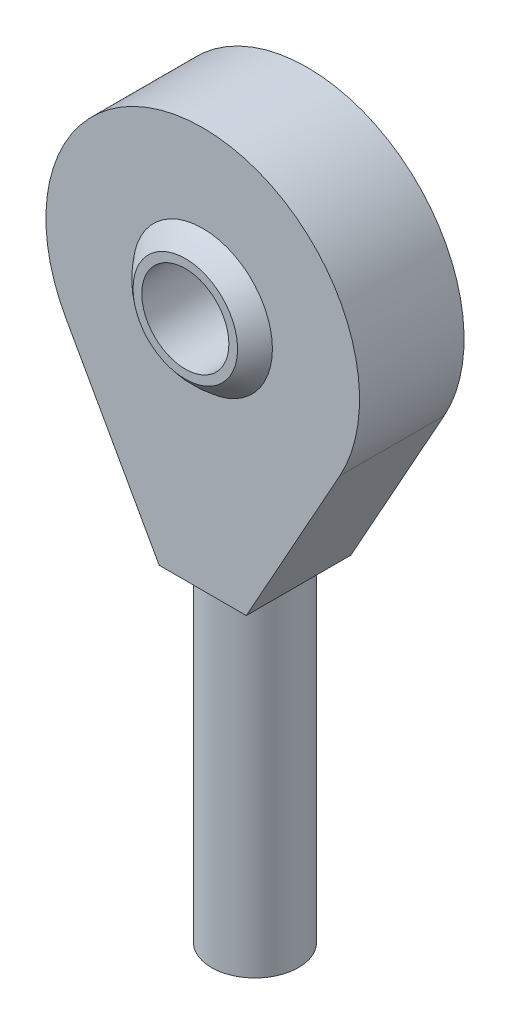
ISO-10303-21;
HEADER;
FILE_DESCRIPTION(('STEP AP214'),'2;1');
FILE_NAME('part.step','',(''),(''),'','','');
FILE_SCHEMA(('AUTOMOTIVE_DESIGN { 1 0 10303 214 1 1 1 1 }'));
ENDSEC;
DATA;
#1=APPLICATION_CONTEXT('core data for automotive mechanical design processes');
#2=APPLICATION_PROTOCOL_DEFINITION('international standard','automotive_design',2000,#1);
#3=PRODUCT_CONTEXT('',#1,'mechanical');
#4=PRODUCT('Part','Part','',(#3));
#5=PRODUCT_RELATED_PRODUCT_CATEGORY('part','',(#4));
#6=PRODUCT_DEFINITION_FORMATION('','',#4);
#7=PRODUCT_DEFINITION_CONTEXT('part definition',#1,'design');
#8=PRODUCT_DEFINITION('design','',#6,#7);
#9=PRODUCT_DEFINITION_SHAPE('','',#8);
#10=(LENGTH_UNIT() NAMED_UNIT(*) SI_UNIT(.MILLI.,.METRE.));
#11=(NAMED_UNIT(*) PLANE_ANGLE_UNIT() SI_UNIT($,.RADIAN.));
#12=(NAMED_UNIT(*) SI_UNIT($,.STERADIAN.) SOLID_ANGLE_UNIT());
#13=UNCERTAINTY_MEASURE_WITH_UNIT(LENGTH_MEASURE(1.E-05),#10,'distance_accuracy_value','');
#14=(GEOMETRIC_REPRESENTATION_CONTEXT(3) GLOBAL_UNCERTAINTY_ASSIGNED_CONTEXT((#13)) GLOBAL_UNIT_ASSIGNED_CONTEXT((#10,
#11,#12)) REPRESENTATION_CONTEXT('',''));
#15=CARTESIAN_POINT('',(0.,0.,0.));
#16=DIRECTION('',(0.,0.,1.));
#17=DIRECTION('',(1.,0.,0.));
#18=AXIS2_PLACEMENT_3D('',#15,#16,#17);
#19=CARTESIAN_POINT('',(0.,32.9999999999935,3.));
#20=DIRECTION('',(0.,0.,1.));
#21=DIRECTION('',(1.,0.,0.));
#22=AXIS2_PLACEMENT_3D('',#19,#20,#21);
#23=PLANE('',#22);
#24=DIRECTION('',(1.,0.,0.));
#25=VECTOR('',#24,1.);
#26=CARTESIAN_POINT('',(-2.5,19.,3.));
#27=LINE('',#26,#25);
#28=CARTESIAN_POINT('',(-2.5,19.,3.));
#29=VERTEX_POINT('',#28);
#30=CARTESIAN_POINT('',(2.5,19.,3.));
#31=VERTEX_POINT('',#30);
#32=EDGE_CURVE('E96',#29,#31,#27,.T.);
#33=ORIENTED_EDGE('',*,*,#32,.T.);
#34=DIRECTION('',(0.486880620855715,0.873468523207994,0.));
#35=VECTOR('',#34,1.);
#36=CARTESIAN_POINT('',(2.5,19.,3.));
#37=LINE('',#36,#35);
#38=CARTESIAN_POINT('',(7.86121670887189,28.6180744122986,3.));
#39=VERTEX_POINT('',#38);
#40=EDGE_CURVE('E91',#31,#39,#37,.T.);
#41=ORIENTED_EDGE('',*,*,#40,.T.);
#42=CARTESIAN_POINT('',(0.,32.9999999999935,3.));
#43=DIRECTION('',(0.,0.,1.));
#44=DIRECTION('',(1.,0.,0.));
#45=AXIS2_PLACEMENT_3D('',#42,#43,#44);
#46=CIRCLE('',#45,8.99999999999684);
#47=CARTESIAN_POINT('',(-7.86121670887194,28.6180744122986,3.));
#48=VERTEX_POINT('',#47);
#49=EDGE_CURVE('E94',#39,#48,#46,.T.);
#50=ORIENTED_EDGE('',*,*,#49,.T.);
#51=DIRECTION('',(0.486880620855715,-0.873468523207994,0.));
#52=VECTOR('',#51,1.);
#53=CARTESIAN_POINT('',(-2.5,19.,3.));
#54=LINE('',#53,#52);
#55=EDGE_CURVE('E60',#48,#29,#54,.T.);
#56=ORIENTED_EDGE('',*,*,#55,.T.);
#57=EDGE_LOOP('',(#33,#41,#50,#56));
#58=FACE_BOUND('',#57,.T.);
#59=CARTESIAN_POINT('',(0.,33.,3.));
#60=DIRECTION('',(0.,0.,1.));
#61=DIRECTION('',(1.,0.,0.));
#62=AXIS2_PLACEMENT_3D('',#59,#60,#61);
#63=CIRCLE('',#62,4.);
#64=CARTESIAN_POINT('',(4.,33.,3.));
#65=VERTEX_POINT('',#64);
#66=EDGE_CURVE('E113',#65,#65,#63,.F.);
#67=ORIENTED_EDGE('',*,*,#66,.T.);
#68=EDGE_LOOP('',(#67));
#69=FACE_BOUND('',#68,.T.);
#70=ADVANCED_FACE('F41',(#58,#69),#23,.T.);
#71=CARTESIAN_POINT('',(0.,32.9999999999935,-3.));
#72=DIRECTION('',(0.,0.,1.));
#73=DIRECTION('',(1.,0.,0.));
#74=AXIS2_PLACEMENT_3D('',#71,#72,#73);
#75=PLANE('',#74);
#76=DIRECTION('',(1.,0.,0.));
#77=VECTOR('',#76,1.);
#78=CARTESIAN_POINT('',(-2.5,19.,-3.));
#79=LINE('',#78,#77);
#80=CARTESIAN_POINT('',(-2.5,19.,-3.));
#81=VERTEX_POINT('',#80);
#82=CARTESIAN_POINT('',(2.5,19.,-3.));
#83=VERTEX_POINT('',#82);
#84=EDGE_CURVE('E110',#81,#83,#79,.T.);
#85=ORIENTED_EDGE('',*,*,#84,.F.);
#86=DIRECTION('',(0.486880620855715,-0.873468523207994,0.));
#87=VECTOR('',#86,1.);
#88=CARTESIAN_POINT('',(-2.5,19.,-3.));
#89=LINE('',#88,#87);
#90=CARTESIAN_POINT('',(-7.86121670887194,28.6180744122986,-3.));
#91=VERTEX_POINT('',#90);
#92=EDGE_CURVE('E83',#91,#81,#89,.T.);
#93=ORIENTED_EDGE('',*,*,#92,.F.);
#94=CARTESIAN_POINT('',(0.,32.9999999999935,-3.));
#95=DIRECTION('',(0.,0.,1.));
#96=DIRECTION('',(1.,0.,0.));
#97=AXIS2_PLACEMENT_3D('',#94,#95,#96);
#98=CIRCLE('',#97,8.99999999999684);
#99=CARTESIAN_POINT('',(7.86121670887189,28.6180744122986,-3.));
#100=VERTEX_POINT('',#99);
#101=EDGE_CURVE('E77',#100,#91,#98,.T.);
#102=ORIENTED_EDGE('',*,*,#101,.F.);
#103=DIRECTION('',(0.486880620855715,0.873468523207994,0.));
#104=VECTOR('',#103,1.);
#105=CARTESIAN_POINT('',(2.5,19.,-3.));
#106=LINE('',#105,#104);
#107=EDGE_CURVE('E101',#83,#100,#106,.T.);
#108=ORIENTED_EDGE('',*,*,#107,.F.);
#109=EDGE_LOOP('',(#85,#93,#102,#108));
#110=FACE_BOUND('',#109,.T.);
#111=CARTESIAN_POINT('',(0.,33.,-3.));
#112=DIRECTION('',(0.,0.,1.));
#113=DIRECTION('',(1.,0.,0.));
#114=AXIS2_PLACEMENT_3D('',#111,#112,#113);
#115=CIRCLE('',#114,4.);
#116=CARTESIAN_POINT('',(4.,33.,-3.));
#117=VERTEX_POINT('',#116);
#118=EDGE_CURVE('E12',#117,#117,#115,.F.);
#119=ORIENTED_EDGE('',*,*,#118,.F.);
#120=EDGE_LOOP('',(#119));
#121=FACE_BOUND('',#120,.T.);
#122=ADVANCED_FACE('F154',(#110,#121),#75,.F.);
#123=CARTESIAN_POINT('',(-2.5,19.,3.));
#124=DIRECTION('',(0.,1.,0.));
#125=DIRECTION('',(0.,0.,1.));
#126=AXIS2_PLACEMENT_3D('',#123,#124,#125);
#127=PLANE('',#126);
#128=ORIENTED_EDGE('',*,*,#84,.T.);
#129=DIRECTION('',(0.,0.,-1.));
#130=VECTOR('',#129,1.);
#131=CARTESIAN_POINT('',(2.5,19.,3.));
#132=LINE('',#131,#130);
#133=EDGE_CURVE('E51',#31,#83,#132,.T.);
#134=ORIENTED_EDGE('',*,*,#133,.F.);
#135=ORIENTED_EDGE('',*,*,#32,.F.);
#136=DIRECTION('',(0.,0.,-1.));
#137=VECTOR('',#136,1.);
#138=CARTESIAN_POINT('',(-2.5,19.,3.));
#139=LINE('',#138,#137);
#140=EDGE_CURVE('E106',#29,#81,#139,.T.);
#141=ORIENTED_EDGE('',*,*,#140,.T.);
#142=EDGE_LOOP('',(#128,#134,#135,#141));
#143=FACE_BOUND('',#142,.T.);
#144=ADVANCED_FACE('F43',(#143),#127,.F.);
#145=CARTESIAN_POINT('',(2.5,19.,3.));
#146=DIRECTION('',(-0.873468523207994,0.486880620855715,0.));
#147=DIRECTION('',(-0.486880620855715,-0.873468523207994,0.));
#148=AXIS2_PLACEMENT_3D('',#145,#146,#147);
#149=PLANE('',#148);
#150=ORIENTED_EDGE('',*,*,#107,.T.);
#151=DIRECTION('',(0.,0.,-1.));
#152=VECTOR('',#151,1.);
#153=CARTESIAN_POINT('',(7.86121670887189,28.6180744122986,3.));
#154=LINE('',#153,#152);
#155=EDGE_CURVE('E99',#39,#100,#154,.T.);
#156=ORIENTED_EDGE('',*,*,#155,.F.);
#157=ORIENTED_EDGE('',*,*,#40,.F.);
#158=ORIENTED_EDGE('',*,*,#133,.T.);
#159=EDGE_LOOP('',(#150,#156,#157,#158));
#160=FACE_BOUND('',#159,.T.);
#161=ADVANCED_FACE('F100',(#160),#149,.F.);
#162=CARTESIAN_POINT('',(0.,32.9999999999935,3.));
#163=DIRECTION('',(0.,0.,-1.));
#164=DIRECTION('',(-1.,0.,0.));
#165=AXIS2_PLACEMENT_3D('',#162,#163,#164);
#166=CYLINDRICAL_SURFACE('',#165,8.99999999999684);
#167=ORIENTED_EDGE('',*,*,#101,.T.);
#168=DIRECTION('',(0.,0.,-1.));
#169=VECTOR('',#168,1.);
#170=CARTESIAN_POINT('',(-7.86121670887194,28.6180744122986,3.));
#171=LINE('',#170,#169);
#172=EDGE_CURVE('E102',#48,#91,#171,.T.);
#173=ORIENTED_EDGE('',*,*,#172,.F.);
#174=ORIENTED_EDGE('',*,*,#49,.F.);
#175=ORIENTED_EDGE('',*,*,#155,.T.);
#176=EDGE_LOOP('',(#167,#173,#174,#175));
#177=FACE_BOUND('',#176,.T.);
#178=ADVANCED_FACE('F104',(#177),#166,.T.);
#179=CARTESIAN_POINT('',(-2.5,19.,3.));
#180=DIRECTION('',(0.873468523207994,0.486880620855715,0.));
#181=DIRECTION('',(-0.486880620855715,0.873468523207994,0.));
#182=AXIS2_PLACEMENT_3D('',#179,#180,#181);
#183=PLANE('',#182);
#184=ORIENTED_EDGE('',*,*,#92,.T.);
#185=ORIENTED_EDGE('',*,*,#140,.F.);
#186=ORIENTED_EDGE('',*,*,#55,.F.);
#187=ORIENTED_EDGE('',*,*,#172,.T.);
#188=EDGE_LOOP('',(#184,#185,#186,#187));
#189=FACE_BOUND('',#188,.T.);
#190=ADVANCED_FACE('F163',(#189),#183,.F.);
#191=CARTESIAN_POINT('',(0.,33.,0.));
#192=DIRECTION('',(-1.,0.,0.));
#193=DIRECTION('',(0.,1.,0.));
#194=AXIS2_PLACEMENT_3D('',#191,#192,#193);
#195=SPHERICAL_SURFACE('',#194,5.);
#196=CARTESIAN_POINT('',(0.,33.,0.));
#197=DIRECTION('',(0.,0.,1.));
#198=DIRECTION('',(1.,0.,0.));
#199=AXIS2_PLACEMENT_3D('',#196,#197,#198);
#200=SPHERICAL_SURFACE('',#199,5.);
#201=CARTESIAN_POINT('',(0.,33.,-4.));
#202=DIRECTION('',(0.,0.,1.));
#203=DIRECTION('',(1.,0.,0.));
#204=AXIS2_PLACEMENT_3D('',#201,#202,#203);
#205=CIRCLE('',#204,3.);
#206=CARTESIAN_POINT('',(3.,33.,-4.));
#207=VERTEX_POINT('',#206);
#208=EDGE_CURVE('E119',#207,#207,#205,.T.);
#209=ORIENTED_EDGE('',*,*,#208,.T.);
#210=EDGE_LOOP('',(#209));
#211=FACE_BOUND('',#210,.T.);
#212=ORIENTED_EDGE('',*,*,#118,.T.);
#213=EDGE_LOOP('',(#212));
#214=FACE_BOUND('',#213,.T.);
#215=ADVANCED_FACE('F166',(#211,#214),#200,.T.);
#216=CARTESIAN_POINT('',(0.,33.,0.));
#217=DIRECTION('',(0.,0.,-1.));
#218=DIRECTION('',(-1.,0.,0.));
#219=AXIS2_PLACEMENT_3D('',#216,#217,#218);
#220=SPHERICAL_SURFACE('',#219,5.);
#221=CARTESIAN_POINT('',(0.,33.,4.));
#222=DIRECTION('',(0.,0.,-1.));
#223=DIRECTION('',(-1.,0.,0.));
#224=AXIS2_PLACEMENT_3D('',#221,#222,#223);
#225=CIRCLE('',#224,3.);
#226=CARTESIAN_POINT('',(-3.,33.,4.));
#227=VERTEX_POINT('',#226);
#228=EDGE_CURVE('E45',#227,#227,#225,.T.);
#229=ORIENTED_EDGE('',*,*,#228,.T.);
#230=EDGE_LOOP('',(#229));
#231=FACE_BOUND('',#230,.T.);
#232=ORIENTED_EDGE('',*,*,#66,.F.);
#233=EDGE_LOOP('',(#232));
#234=FACE_BOUND('',#233,.T.);
#235=ADVANCED_FACE('F151',(#231,#234),#220,.T.);
#236=CARTESIAN_POINT('',(-5.,23.,-4.));
#237=DIRECTION('',(0.,0.,1.));
#238=DIRECTION('',(1.,0.,0.));
#239=AXIS2_PLACEMENT_3D('',#236,#237,#238);
#240=PLANE('',#239);
#241=CARTESIAN_POINT('',(0.,32.9999999999935,-4.));
#242=DIRECTION('',(0.,0.,1.));
#243=DIRECTION('',(1.,0.,0.));
#244=AXIS2_PLACEMENT_3D('',#241,#242,#243);
#245=CIRCLE('',#244,2.5);
#246=CARTESIAN_POINT('',(2.49999999999994,32.9999999999935,-4.));
#247=VERTEX_POINT('',#246);
#248=EDGE_CURVE('E126',#247,#247,#245,.T.);
#249=ORIENTED_EDGE('',*,*,#248,.T.);
#250=EDGE_LOOP('',(#249));
#251=FACE_BOUND('',#250,.T.);
#252=ORIENTED_EDGE('',*,*,#208,.F.);
#253=EDGE_LOOP('',(#252));
#254=FACE_BOUND('',#253,.T.);
#255=ADVANCED_FACE('F143',(#251,#254),#240,.F.);
#256=CARTESIAN_POINT('',(-5.,23.,4.));
#257=DIRECTION('',(0.,0.,-1.));
#258=DIRECTION('',(-1.,0.,0.));
#259=AXIS2_PLACEMENT_3D('',#256,#257,#258);
#260=PLANE('',#259);
#261=CARTESIAN_POINT('',(0.,32.9999999999935,4.));
#262=DIRECTION('',(0.,0.,1.));
#263=DIRECTION('',(1.,0.,0.));
#264=AXIS2_PLACEMENT_3D('',#261,#262,#263);
#265=CIRCLE('',#264,2.5);
#266=CARTESIAN_POINT('',(2.49999999999994,32.9999999999935,4.));
#267=VERTEX_POINT('',#266);
#268=EDGE_CURVE('E130',#267,#267,#265,.T.);
#269=ORIENTED_EDGE('',*,*,#268,.F.);
#270=EDGE_LOOP('',(#269));
#271=FACE_BOUND('',#270,.T.);
#272=ORIENTED_EDGE('',*,*,#228,.F.);
#273=EDGE_LOOP('',(#272));
#274=FACE_BOUND('',#273,.T.);
#275=ADVANCED_FACE('F140',(#271,#274),#260,.F.);
#276=CARTESIAN_POINT('',(0.,32.9999999999935,-4.));
#277=DIRECTION('',(0.,0.,1.));
#278=DIRECTION('',(1.,0.,0.));
#279=AXIS2_PLACEMENT_3D('',#276,#277,#278);
#280=CYLINDRICAL_SURFACE('',#279,2.5);
#281=ORIENTED_EDGE('',*,*,#248,.F.);
#282=EDGE_LOOP('',(#281));
#283=FACE_BOUND('',#282,.T.);
#284=ORIENTED_EDGE('',*,*,#268,.T.);
#285=EDGE_LOOP('',(#284));
#286=FACE_BOUND('',#285,.T.);
#287=ADVANCED_FACE('F138',(#283,#286),#280,.F.);
#288=CLOSED_SHELL('',(#70,#122,#144,#161,#178,#190,#215,#235,#255,#275,#287));
#289=MANIFOLD_SOLID_BREP('B2',#288);
#290=CARTESIAN_POINT('',(0.,19.,0.));
#291=DIRECTION('',(0.,-1.,0.));
#292=DIRECTION('',(0.,0.,-1.));
#293=AXIS2_PLACEMENT_3D('',#290,#291,#292);
#294=CYLINDRICAL_SURFACE('',#293,2.5);
#295=CARTESIAN_POINT('',(0.,19.,0.));
#296=DIRECTION('',(0.,1.,0.));
#297=DIRECTION('',(0.,0.,1.));
#298=AXIS2_PLACEMENT_3D('',#295,#296,#297);
#299=CIRCLE('',#298,2.5);
#300=CARTESIAN_POINT('',(0.,19.,2.5));
#301=VERTEX_POINT('',#300);
#302=EDGE_CURVE('E40',#301,#301,#299,.T.);
#303=ORIENTED_EDGE('',*,*,#302,.F.);
#304=EDGE_LOOP('',(#303));
#305=FACE_BOUND('',#304,.T.);
#306=CARTESIAN_POINT('',(0.,0.,0.));
#307=DIRECTION('',(0.,1.,0.));
#308=DIRECTION('',(0.,0.,1.));
#309=AXIS2_PLACEMENT_3D('',#306,#307,#308);
#310=CIRCLE('',#309,2.5);
#311=CARTESIAN_POINT('',(0.,0.,2.5));
#312=VERTEX_POINT('',#311);
#313=EDGE_CURVE('E248',#312,#312,#310,.T.);
#314=ORIENTED_EDGE('',*,*,#313,.T.);
#315=EDGE_LOOP('',(#314));
#316=FACE_BOUND('',#315,.T.);
#317=ADVANCED_FACE('F245',(#305,#316),#294,.T.);
#318=CARTESIAN_POINT('',(0.,19.,0.));
#319=DIRECTION('',(0.,1.,0.));
#320=DIRECTION('',(0.,0.,1.));
#321=AXIS2_PLACEMENT_3D('',#318,#319,#320);
#322=PLANE('',#321);
#323=ORIENTED_EDGE('',*,*,#302,.T.);
#324=EDGE_LOOP('',(#323));
#325=FACE_BOUND('',#324,.T.);
#326=ADVANCED_FACE('F260',(#325),#322,.T.);
#327=CARTESIAN_POINT('',(0.,0.,0.));
#328=DIRECTION('',(0.,1.,0.));
#329=DIRECTION('',(0.,0.,1.));
#330=AXIS2_PLACEMENT_3D('',#327,#328,#329);
#331=PLANE('',#330);
#332=ORIENTED_EDGE('',*,*,#313,.F.);
#333=EDGE_LOOP('',(#332));
#334=FACE_BOUND('',#333,.T.);
#335=ADVANCED_FACE('F258',(#334),#331,.F.);
#336=CLOSED_SHELL('',(#317,#326,#335));
#337=MANIFOLD_SOLID_BREP('B6',#336);
#338=ADVANCED_BREP_SHAPE_REPRESENTATION('',(#18,#289,#337),#14);
#339=SHAPE_DEFINITION_REPRESENTATION(#9,#338);
ENDSEC;
END-ISO-10303-21;
